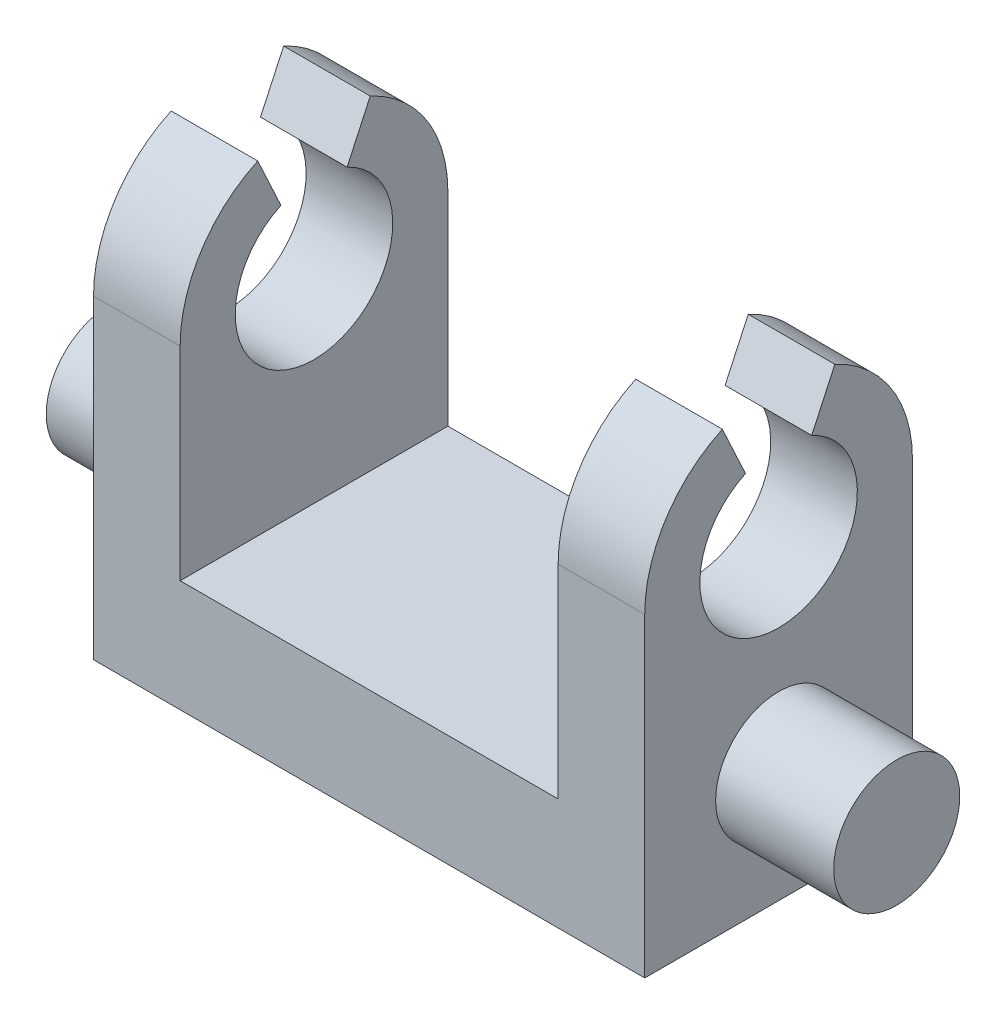
ISO-10303-21;
HEADER;
FILE_DESCRIPTION(('STEP AP214'),'2;1');
FILE_NAME('part.step','',(''),(''),'','','');
FILE_SCHEMA(('AUTOMOTIVE_DESIGN { 1 0 10303 214 1 1 1 1 }'));
ENDSEC;
DATA;
#1=APPLICATION_CONTEXT('core data for automotive mechanical design processes');
#2=APPLICATION_PROTOCOL_DEFINITION('international standard','automotive_design',2000,#1);
#3=PRODUCT_CONTEXT('',#1,'mechanical');
#4=PRODUCT('Part','Part','',(#3));
#5=PRODUCT_RELATED_PRODUCT_CATEGORY('part','',(#4));
#6=PRODUCT_DEFINITION_FORMATION('','',#4);
#7=PRODUCT_DEFINITION_CONTEXT('part definition',#1,'design');
#8=PRODUCT_DEFINITION('design','',#6,#7);
#9=PRODUCT_DEFINITION_SHAPE('','',#8);
#10=(LENGTH_UNIT() NAMED_UNIT(*) SI_UNIT(.MILLI.,.METRE.));
#11=(NAMED_UNIT(*) PLANE_ANGLE_UNIT() SI_UNIT($,.RADIAN.));
#12=(NAMED_UNIT(*) SI_UNIT($,.STERADIAN.) SOLID_ANGLE_UNIT());
#13=UNCERTAINTY_MEASURE_WITH_UNIT(LENGTH_MEASURE(1.E-05),#10,'distance_accuracy_value','');
#14=(GEOMETRIC_REPRESENTATION_CONTEXT(3) GLOBAL_UNCERTAINTY_ASSIGNED_CONTEXT((#13)) GLOBAL_UNIT_ASSIGNED_CONTEXT((#10,
#11,#12)) REPRESENTATION_CONTEXT('',''));
#15=CARTESIAN_POINT('',(0.,0.,0.));
#16=DIRECTION('',(0.,0.,1.));
#17=DIRECTION('',(1.,0.,0.));
#18=AXIS2_PLACEMENT_3D('',#15,#16,#17);
#19=CARTESIAN_POINT('',(35.,25.,0.));
#20=DIRECTION('',(-1.,0.,0.));
#21=DIRECTION('',(0.,0.,1.));
#22=AXIS2_PLACEMENT_3D('',#19,#20,#21);
#23=CYLINDRICAL_SURFACE('',#22,17.);
#24=CARTESIAN_POINT('',(-24.,25.,0.));
#25=DIRECTION('',(-1.,0.,0.));
#26=DIRECTION('',(0.,0.,1.));
#27=AXIS2_PLACEMENT_3D('',#24,#25,#26);
#28=CIRCLE('',#27,17.);
#29=CARTESIAN_POINT('',(-24.,25.,17.));
#30=VERTEX_POINT('',#29);
#31=CARTESIAN_POINT('',(-24.,40.4258547185672,7.14443883042323));
#32=VERTEX_POINT('',#31);
#33=EDGE_CURVE('E256',#30,#32,#28,.T.);
#34=ORIENTED_EDGE('',*,*,#33,.T.);
#35=DIRECTION('',(-1.,0.,0.));
#36=VECTOR('',#35,1.);
#37=CARTESIAN_POINT('',(51.3399201519814,40.4258547185672,7.14443883042323));
#38=LINE('',#37,#36);
#39=CARTESIAN_POINT('',(-35.,40.4258547185672,7.14443883042323));
#40=VERTEX_POINT('',#39);
#41=EDGE_CURVE('E62',#32,#40,#38,.T.);
#42=ORIENTED_EDGE('',*,*,#41,.T.);
#43=CARTESIAN_POINT('',(-35.,25.,0.));
#44=DIRECTION('',(1.,0.,0.));
#45=DIRECTION('',(0.,0.,1.));
#46=AXIS2_PLACEMENT_3D('',#43,#44,#45);
#47=CIRCLE('',#46,17.);
#48=CARTESIAN_POINT('',(-35.,25.,17.));
#49=VERTEX_POINT('',#48);
#50=EDGE_CURVE('E185',#40,#49,#47,.T.);
#51=ORIENTED_EDGE('',*,*,#50,.T.);
#52=DIRECTION('',(-1.,0.,0.));
#53=VECTOR('',#52,1.);
#54=CARTESIAN_POINT('',(35.,25.,17.));
#55=LINE('',#54,#53);
#56=EDGE_CURVE('E207',#30,#49,#55,.T.);
#57=ORIENTED_EDGE('',*,*,#56,.F.);
#58=EDGE_LOOP('',(#34,#42,#51,#57));
#59=FACE_BOUND('',#58,.T.);
#60=ADVANCED_FACE('F47',(#59),#23,.T.);
#61=CARTESIAN_POINT('',(35.,25.,0.));
#62=DIRECTION('',(1.,0.,0.));
#63=DIRECTION('',(0.,0.,1.));
#64=AXIS2_PLACEMENT_3D('',#61,#62,#63);
#65=CIRCLE('',#64,17.);
#66=CARTESIAN_POINT('',(35.,40.4258547185672,7.14443883042323));
#67=VERTEX_POINT('',#66);
#68=CARTESIAN_POINT('',(35.,25.,17.));
#69=VERTEX_POINT('',#68);
#70=EDGE_CURVE('E197',#67,#69,#65,.T.);
#71=ORIENTED_EDGE('',*,*,#70,.F.);
#72=CARTESIAN_POINT('',(24.,40.4258547185672,7.14443883042323));
#73=VERTEX_POINT('',#72);
#74=EDGE_CURVE('E307',#67,#73,#38,.T.);
#75=ORIENTED_EDGE('',*,*,#74,.T.);
#76=CARTESIAN_POINT('',(24.,25.,0.));
#77=DIRECTION('',(1.,0.,0.));
#78=DIRECTION('',(0.,1.,0.));
#79=AXIS2_PLACEMENT_3D('',#76,#77,#78);
#80=CIRCLE('',#79,17.);
#81=CARTESIAN_POINT('',(24.,25.,17.));
#82=VERTEX_POINT('',#81);
#83=EDGE_CURVE('E248',#73,#82,#80,.T.);
#84=ORIENTED_EDGE('',*,*,#83,.T.);
#85=EDGE_CURVE('E208',#69,#82,#55,.T.);
#86=ORIENTED_EDGE('',*,*,#85,.F.);
#87=EDGE_LOOP('',(#71,#75,#84,#86));
#88=FACE_BOUND('',#87,.T.);
#89=ADVANCED_FACE('F331',(#88),#23,.T.);
#90=CARTESIAN_POINT('',(-35.,25.,-17.));
#91=VERTEX_POINT('',#90);
#92=CARTESIAN_POINT('',(-35.,40.4258547185672,-7.14443883042322));
#93=VERTEX_POINT('',#92);
#94=EDGE_CURVE('E176',#91,#93,#47,.T.);
#95=ORIENTED_EDGE('',*,*,#94,.T.);
#96=DIRECTION('',(-1.,0.,0.));
#97=VECTOR('',#96,1.);
#98=CARTESIAN_POINT('',(51.3399201519814,40.4258547185672,-7.14443883042322));
#99=LINE('',#98,#97);
#100=CARTESIAN_POINT('',(-24.,40.4258547185672,-7.14443883042322));
#101=VERTEX_POINT('',#100);
#102=EDGE_CURVE('E158',#101,#93,#99,.T.);
#103=ORIENTED_EDGE('',*,*,#102,.F.);
#104=CARTESIAN_POINT('',(-24.,25.,-17.));
#105=VERTEX_POINT('',#104);
#106=EDGE_CURVE('E255',#101,#105,#28,.T.);
#107=ORIENTED_EDGE('',*,*,#106,.T.);
#108=DIRECTION('',(-1.,0.,0.));
#109=VECTOR('',#108,1.);
#110=CARTESIAN_POINT('',(35.,25.,-17.));
#111=LINE('',#110,#109);
#112=EDGE_CURVE('E182',#105,#91,#111,.T.);
#113=ORIENTED_EDGE('',*,*,#112,.T.);
#114=EDGE_LOOP('',(#95,#103,#107,#113));
#115=FACE_BOUND('',#114,.T.);
#116=ADVANCED_FACE('F180',(#115),#23,.T.);
#117=CARTESIAN_POINT('',(35.,25.,0.));
#118=DIRECTION('',(-1.,0.,0.));
#119=DIRECTION('',(0.,0.,1.));
#120=AXIS2_PLACEMENT_3D('',#117,#118,#119);
#121=CYLINDRICAL_SURFACE('',#120,10.);
#122=DIRECTION('',(-1.,0.,0.));
#123=VECTOR('',#122,1.);
#124=CARTESIAN_POINT('',(51.3399201519814,34.0740321873925,4.20261107671955));
#125=LINE('',#124,#123);
#126=CARTESIAN_POINT('',(-24.,34.0740321873925,4.20261107671955));
#127=VERTEX_POINT('',#126);
#128=CARTESIAN_POINT('',(-35.,34.0740321873925,4.20261107671955));
#129=VERTEX_POINT('',#128);
#130=EDGE_CURVE('E304',#127,#129,#125,.T.);
#131=ORIENTED_EDGE('',*,*,#130,.F.);
#132=CARTESIAN_POINT('',(-24.,25.,0.));
#133=DIRECTION('',(-1.,0.,0.));
#134=DIRECTION('',(0.,0.,1.));
#135=AXIS2_PLACEMENT_3D('',#132,#133,#134);
#136=CIRCLE('',#135,10.);
#137=CARTESIAN_POINT('',(-24.,34.0740321873925,-4.20261107671954));
#138=VERTEX_POINT('',#137);
#139=EDGE_CURVE('E228',#138,#127,#136,.T.);
#140=ORIENTED_EDGE('',*,*,#139,.F.);
#141=DIRECTION('',(-1.,0.,0.));
#142=VECTOR('',#141,1.);
#143=CARTESIAN_POINT('',(51.3399201519814,34.0740321873925,-4.20261107671954));
#144=LINE('',#143,#142);
#145=CARTESIAN_POINT('',(-35.,34.0740321873925,-4.20261107671954));
#146=VERTEX_POINT('',#145);
#147=EDGE_CURVE('E70',#138,#146,#144,.T.);
#148=ORIENTED_EDGE('',*,*,#147,.T.);
#149=CARTESIAN_POINT('',(-35.,25.,0.));
#150=DIRECTION('',(1.,0.,0.));
#151=DIRECTION('',(0.,0.,-1.));
#152=AXIS2_PLACEMENT_3D('',#149,#150,#151);
#153=CIRCLE('',#152,10.);
#154=EDGE_CURVE('E178',#129,#146,#153,.T.);
#155=ORIENTED_EDGE('',*,*,#154,.F.);
#156=EDGE_LOOP('',(#131,#140,#148,#155));
#157=FACE_BOUND('',#156,.T.);
#158=ADVANCED_FACE('F352',(#157),#121,.F.);
#159=CARTESIAN_POINT('',(50.,0.,0.));
#160=DIRECTION('',(-1.,0.,0.));
#161=DIRECTION('',(0.,0.,1.));
#162=AXIS2_PLACEMENT_3D('',#159,#160,#161);
#163=CYLINDRICAL_SURFACE('',#162,8.);
#164=CARTESIAN_POINT('',(50.,0.,0.));
#165=DIRECTION('',(1.,0.,0.));
#166=DIRECTION('',(0.,0.,-1.));
#167=AXIS2_PLACEMENT_3D('',#164,#165,#166);
#168=CIRCLE('',#167,8.);
#169=CARTESIAN_POINT('',(50.,0.,-8.));
#170=VERTEX_POINT('',#169);
#171=EDGE_CURVE('E212',#170,#170,#168,.T.);
#172=ORIENTED_EDGE('',*,*,#171,.F.);
#173=EDGE_LOOP('',(#172));
#174=FACE_BOUND('',#173,.T.);
#175=CARTESIAN_POINT('',(35.,0.,0.));
#176=DIRECTION('',(-1.,0.,0.));
#177=DIRECTION('',(0.,0.,1.));
#178=AXIS2_PLACEMENT_3D('',#175,#176,#177);
#179=CIRCLE('',#178,8.);
#180=CARTESIAN_POINT('',(35.,0.,8.));
#181=VERTEX_POINT('',#180);
#182=EDGE_CURVE('E215',#181,#181,#179,.T.);
#183=ORIENTED_EDGE('',*,*,#182,.F.);
#184=EDGE_LOOP('',(#183));
#185=FACE_BOUND('',#184,.T.);
#186=ADVANCED_FACE('F356',(#174,#185),#163,.T.);
#187=CARTESIAN_POINT('',(50.,0.,0.));
#188=DIRECTION('',(1.,0.,0.));
#189=DIRECTION('',(0.,0.,-1.));
#190=AXIS2_PLACEMENT_3D('',#187,#188,#189);
#191=PLANE('',#190);
#192=ORIENTED_EDGE('',*,*,#171,.T.);
#193=EDGE_LOOP('',(#192));
#194=FACE_BOUND('',#193,.T.);
#195=ADVANCED_FACE('F363',(#194),#191,.T.);
#196=CARTESIAN_POINT('',(35.,25.,0.));
#197=DIRECTION('',(-1.,0.,0.));
#198=DIRECTION('',(0.,0.,1.));
#199=AXIS2_PLACEMENT_3D('',#196,#197,#198);
#200=PLANE('',#199);
#201=ORIENTED_EDGE('',*,*,#182,.T.);
#202=EDGE_LOOP('',(#201));
#203=FACE_BOUND('',#202,.T.);
#204=CARTESIAN_POINT('',(35.,25.,0.));
#205=DIRECTION('',(1.,0.,0.));
#206=DIRECTION('',(0.,0.,-1.));
#207=AXIS2_PLACEMENT_3D('',#204,#205,#206);
#208=CIRCLE('',#207,10.);
#209=CARTESIAN_POINT('',(35.,34.0740321873925,4.20261107671955));
#210=VERTEX_POINT('',#209);
#211=CARTESIAN_POINT('',(35.,34.0740321873925,-4.20261107671954));
#212=VERTEX_POINT('',#211);
#213=EDGE_CURVE('E189',#210,#212,#208,.T.);
#214=ORIENTED_EDGE('',*,*,#213,.F.);
#215=DIRECTION('',(0.,-0.907403218739245,-0.420261107671954));
#216=VECTOR('',#215,1.);
#217=CARTESIAN_POINT('',(35.,40.4258547185672,7.14443883042323));
#218=LINE('',#217,#216);
#219=EDGE_CURVE('E300',#67,#210,#218,.T.);
#220=ORIENTED_EDGE('',*,*,#219,.F.);
#221=ORIENTED_EDGE('',*,*,#70,.T.);
#222=DIRECTION('',(0.,-1.,0.));
#223=VECTOR('',#222,1.);
#224=CARTESIAN_POINT('',(35.,25.,17.));
#225=LINE('',#224,#223);
#226=CARTESIAN_POINT('',(35.,-15.,17.));
#227=VERTEX_POINT('',#226);
#228=EDGE_CURVE('E267',#69,#227,#225,.T.);
#229=ORIENTED_EDGE('',*,*,#228,.T.);
#230=DIRECTION('',(0.,0.,-1.));
#231=VECTOR('',#230,1.);
#232=CARTESIAN_POINT('',(35.,-15.,17.));
#233=LINE('',#232,#231);
#234=CARTESIAN_POINT('',(35.,-15.,-17.));
#235=VERTEX_POINT('',#234);
#236=EDGE_CURVE('E268',#227,#235,#233,.T.);
#237=ORIENTED_EDGE('',*,*,#236,.T.);
#238=DIRECTION('',(0.,1.,0.));
#239=VECTOR('',#238,1.);
#240=CARTESIAN_POINT('',(35.,25.,-17.));
#241=LINE('',#240,#239);
#242=CARTESIAN_POINT('',(35.,25.,-17.));
#243=VERTEX_POINT('',#242);
#244=EDGE_CURVE('E191',#235,#243,#241,.T.);
#245=ORIENTED_EDGE('',*,*,#244,.T.);
#246=CARTESIAN_POINT('',(35.,40.4258547185672,-7.14443883042322));
#247=VERTEX_POINT('',#246);
#248=EDGE_CURVE('E265',#243,#247,#65,.T.);
#249=ORIENTED_EDGE('',*,*,#248,.T.);
#250=DIRECTION('',(0.,0.907403218739245,-0.420261107671955));
#251=VECTOR('',#250,1.);
#252=CARTESIAN_POINT('',(35.,40.4258547185672,-7.14443883042322));
#253=LINE('',#252,#251);
#254=EDGE_CURVE('E299',#212,#247,#253,.T.);
#255=ORIENTED_EDGE('',*,*,#254,.F.);
#256=EDGE_LOOP('',(#214,#220,#221,#229,#237,#245,#249,#255));
#257=FACE_BOUND('',#256,.T.);
#258=ADVANCED_FACE('F274',(#203,#257),#200,.F.);
#259=CARTESIAN_POINT('',(-35.,25.,0.));
#260=DIRECTION('',(-1.,0.,0.));
#261=DIRECTION('',(0.,0.,1.));
#262=AXIS2_PLACEMENT_3D('',#259,#260,#261);
#263=PLANE('',#262);
#264=DIRECTION('',(0.,0.907403218739245,0.420261107671954));
#265=VECTOR('',#264,1.);
#266=CARTESIAN_POINT('',(-35.,40.4258547185672,7.14443883042323));
#267=LINE('',#266,#265);
#268=EDGE_CURVE('E167',#129,#40,#267,.T.);
#269=ORIENTED_EDGE('',*,*,#268,.F.);
#270=ORIENTED_EDGE('',*,*,#154,.T.);
#271=DIRECTION('',(0.,-0.907403218739245,0.420261107671955));
#272=VECTOR('',#271,1.);
#273=CARTESIAN_POINT('',(-35.,40.4258547185672,-7.14443883042322));
#274=LINE('',#273,#272);
#275=EDGE_CURVE('E161',#93,#146,#274,.T.);
#276=ORIENTED_EDGE('',*,*,#275,.F.);
#277=ORIENTED_EDGE('',*,*,#94,.F.);
#278=DIRECTION('',(0.,1.,0.));
#279=VECTOR('',#278,1.);
#280=CARTESIAN_POINT('',(-35.,25.,-17.));
#281=LINE('',#280,#279);
#282=CARTESIAN_POINT('',(-35.,-15.,-17.));
#283=VERTEX_POINT('',#282);
#284=EDGE_CURVE('E195',#283,#91,#281,.T.);
#285=ORIENTED_EDGE('',*,*,#284,.F.);
#286=DIRECTION('',(0.,0.,-1.));
#287=VECTOR('',#286,1.);
#288=CARTESIAN_POINT('',(-35.,-15.,17.));
#289=LINE('',#288,#287);
#290=CARTESIAN_POINT('',(-35.,-15.,17.));
#291=VERTEX_POINT('',#290);
#292=EDGE_CURVE('E187',#291,#283,#289,.T.);
#293=ORIENTED_EDGE('',*,*,#292,.F.);
#294=DIRECTION('',(0.,-1.,0.));
#295=VECTOR('',#294,1.);
#296=CARTESIAN_POINT('',(-35.,25.,17.));
#297=LINE('',#296,#295);
#298=EDGE_CURVE('E184',#49,#291,#297,.T.);
#299=ORIENTED_EDGE('',*,*,#298,.F.);
#300=ORIENTED_EDGE('',*,*,#50,.F.);
#301=EDGE_LOOP('',(#269,#270,#276,#277,#285,#293,#299,#300));
#302=FACE_BOUND('',#301,.T.);
#303=CARTESIAN_POINT('',(-35.,0.,0.));
#304=DIRECTION('',(-1.,0.,0.));
#305=DIRECTION('',(0.,0.,1.));
#306=AXIS2_PLACEMENT_3D('',#303,#304,#305);
#307=CIRCLE('',#306,8.);
#308=CARTESIAN_POINT('',(-35.,0.,8.));
#309=VERTEX_POINT('',#308);
#310=EDGE_CURVE('E211',#309,#309,#307,.T.);
#311=ORIENTED_EDGE('',*,*,#310,.F.);
#312=EDGE_LOOP('',(#311));
#313=FACE_BOUND('',#312,.T.);
#314=ADVANCED_FACE('F173',(#302,#313),#263,.T.);
#315=CARTESIAN_POINT('',(24.,25.,-17.));
#316=VERTEX_POINT('',#315);
#317=CARTESIAN_POINT('',(24.,40.4258547185672,-7.14443883042322));
#318=VERTEX_POINT('',#317);
#319=EDGE_CURVE('E237',#316,#318,#80,.T.);
#320=ORIENTED_EDGE('',*,*,#319,.T.);
#321=EDGE_CURVE('E166',#247,#318,#99,.T.);
#322=ORIENTED_EDGE('',*,*,#321,.F.);
#323=ORIENTED_EDGE('',*,*,#248,.F.);
#324=EDGE_CURVE('E198',#243,#316,#111,.T.);
#325=ORIENTED_EDGE('',*,*,#324,.T.);
#326=EDGE_LOOP('',(#320,#322,#323,#325));
#327=FACE_BOUND('',#326,.T.);
#328=ADVANCED_FACE('F244',(#327),#23,.T.);
#329=CARTESIAN_POINT('',(35.,25.,17.));
#330=DIRECTION('',(0.,0.,-1.));
#331=DIRECTION('',(0.,1.,0.));
#332=AXIS2_PLACEMENT_3D('',#329,#330,#331);
#333=PLANE('',#332);
#334=DIRECTION('',(0.,-1.,0.));
#335=VECTOR('',#334,1.);
#336=CARTESIAN_POINT('',(24.,25.,17.));
#337=LINE('',#336,#335);
#338=CARTESIAN_POINT('',(24.,-0.810000000000006,17.));
#339=VERTEX_POINT('',#338);
#340=EDGE_CURVE('E231',#82,#339,#337,.T.);
#341=ORIENTED_EDGE('',*,*,#340,.T.);
#342=DIRECTION('',(-1.,0.,0.));
#343=VECTOR('',#342,1.);
#344=CARTESIAN_POINT('',(24.,-0.810000000000006,17.));
#345=LINE('',#344,#343);
#346=CARTESIAN_POINT('',(-24.,-0.810000000000006,17.));
#347=VERTEX_POINT('',#346);
#348=EDGE_CURVE('E290',#339,#347,#345,.T.);
#349=ORIENTED_EDGE('',*,*,#348,.T.);
#350=DIRECTION('',(0.,1.,0.));
#351=VECTOR('',#350,1.);
#352=CARTESIAN_POINT('',(-24.,25.,17.));
#353=LINE('',#352,#351);
#354=EDGE_CURVE('E259',#347,#30,#353,.T.);
#355=ORIENTED_EDGE('',*,*,#354,.T.);
#356=ORIENTED_EDGE('',*,*,#56,.T.);
#357=ORIENTED_EDGE('',*,*,#298,.T.);
#358=DIRECTION('',(-1.,0.,0.));
#359=VECTOR('',#358,1.);
#360=CARTESIAN_POINT('',(35.,-15.,17.));
#361=LINE('',#360,#359);
#362=EDGE_CURVE('E204',#227,#291,#361,.T.);
#363=ORIENTED_EDGE('',*,*,#362,.F.);
#364=ORIENTED_EDGE('',*,*,#228,.F.);
#365=ORIENTED_EDGE('',*,*,#85,.T.);
#366=EDGE_LOOP('',(#341,#349,#355,#356,#357,#363,#364,#365));
#367=FACE_BOUND('',#366,.T.);
#368=ADVANCED_FACE('F342',(#367),#333,.F.);
#369=CARTESIAN_POINT('',(35.,-15.,17.));
#370=DIRECTION('',(0.,1.,0.));
#371=DIRECTION('',(0.,0.,1.));
#372=AXIS2_PLACEMENT_3D('',#369,#370,#371);
#373=PLANE('',#372);
#374=ORIENTED_EDGE('',*,*,#292,.T.);
#375=DIRECTION('',(-1.,0.,0.));
#376=VECTOR('',#375,1.);
#377=CARTESIAN_POINT('',(35.,-15.,-17.));
#378=LINE('',#377,#376);
#379=EDGE_CURVE('E201',#235,#283,#378,.T.);
#380=ORIENTED_EDGE('',*,*,#379,.F.);
#381=ORIENTED_EDGE('',*,*,#236,.F.);
#382=ORIENTED_EDGE('',*,*,#362,.T.);
#383=EDGE_LOOP('',(#374,#380,#381,#382));
#384=FACE_BOUND('',#383,.T.);
#385=ADVANCED_FACE('F348',(#384),#373,.F.);
#386=CARTESIAN_POINT('',(35.,25.,-17.));
#387=DIRECTION('',(0.,0.,1.));
#388=DIRECTION('',(0.,-1.,0.));
#389=AXIS2_PLACEMENT_3D('',#386,#387,#388);
#390=PLANE('',#389);
#391=DIRECTION('',(-1.,0.,0.));
#392=VECTOR('',#391,1.);
#393=CARTESIAN_POINT('',(24.,-0.809999999999994,-17.));
#394=LINE('',#393,#392);
#395=CARTESIAN_POINT('',(24.,-0.809999999999994,-17.));
#396=VERTEX_POINT('',#395);
#397=CARTESIAN_POINT('',(-24.,-0.809999999999994,-17.));
#398=VERTEX_POINT('',#397);
#399=EDGE_CURVE('E280',#396,#398,#394,.T.);
#400=ORIENTED_EDGE('',*,*,#399,.F.);
#401=DIRECTION('',(0.,1.,0.));
#402=VECTOR('',#401,1.);
#403=CARTESIAN_POINT('',(24.,25.,-17.));
#404=LINE('',#403,#402);
#405=EDGE_CURVE('E226',#396,#316,#404,.T.);
#406=ORIENTED_EDGE('',*,*,#405,.T.);
#407=ORIENTED_EDGE('',*,*,#324,.F.);
#408=ORIENTED_EDGE('',*,*,#244,.F.);
#409=ORIENTED_EDGE('',*,*,#379,.T.);
#410=ORIENTED_EDGE('',*,*,#284,.T.);
#411=ORIENTED_EDGE('',*,*,#112,.F.);
#412=DIRECTION('',(0.,-1.,0.));
#413=VECTOR('',#412,1.);
#414=CARTESIAN_POINT('',(-24.,25.,-17.));
#415=LINE('',#414,#413);
#416=EDGE_CURVE('E230',#105,#398,#415,.T.);
#417=ORIENTED_EDGE('',*,*,#416,.T.);
#418=EDGE_LOOP('',(#400,#406,#407,#408,#409,#410,#411,#417));
#419=FACE_BOUND('',#418,.T.);
#420=ADVANCED_FACE('F278',(#419),#390,.F.);
#421=CARTESIAN_POINT('',(24.,34.0740321873925,4.20261107671955));
#422=VERTEX_POINT('',#421);
#423=EDGE_CURVE('E305',#210,#422,#125,.T.);
#424=ORIENTED_EDGE('',*,*,#423,.F.);
#425=ORIENTED_EDGE('',*,*,#213,.T.);
#426=CARTESIAN_POINT('',(24.,34.0740321873925,-4.20261107671954));
#427=VERTEX_POINT('',#426);
#428=EDGE_CURVE('E302',#212,#427,#144,.T.);
#429=ORIENTED_EDGE('',*,*,#428,.T.);
#430=CARTESIAN_POINT('',(24.,25.,0.));
#431=DIRECTION('',(1.,0.,0.));
#432=DIRECTION('',(0.,1.,0.));
#433=AXIS2_PLACEMENT_3D('',#430,#431,#432);
#434=CIRCLE('',#433,10.);
#435=EDGE_CURVE('E223',#422,#427,#434,.T.);
#436=ORIENTED_EDGE('',*,*,#435,.F.);
#437=EDGE_LOOP('',(#424,#425,#429,#436));
#438=FACE_BOUND('',#437,.T.);
#439=ADVANCED_FACE('F317',(#438),#121,.F.);
#440=CARTESIAN_POINT('',(-50.,0.,0.));
#441=DIRECTION('',(1.,0.,0.));
#442=DIRECTION('',(0.,0.,-1.));
#443=AXIS2_PLACEMENT_3D('',#440,#441,#442);
#444=PLANE('',#443);
#445=CARTESIAN_POINT('',(-50.,0.,0.));
#446=DIRECTION('',(1.,0.,0.));
#447=DIRECTION('',(0.,0.,-1.));
#448=AXIS2_PLACEMENT_3D('',#445,#446,#447);
#449=CIRCLE('',#448,8.);
#450=CARTESIAN_POINT('',(-50.,0.,-8.));
#451=VERTEX_POINT('',#450);
#452=EDGE_CURVE('E216',#451,#451,#449,.T.);
#453=ORIENTED_EDGE('',*,*,#452,.F.);
#454=EDGE_LOOP('',(#453));
#455=FACE_BOUND('',#454,.T.);
#456=ADVANCED_FACE('F368',(#455),#444,.F.);
#457=ORIENTED_EDGE('',*,*,#310,.T.);
#458=EDGE_LOOP('',(#457));
#459=FACE_BOUND('',#458,.T.);
#460=ORIENTED_EDGE('',*,*,#452,.T.);
#461=EDGE_LOOP('',(#460));
#462=FACE_BOUND('',#461,.T.);
#463=ADVANCED_FACE('F49',(#459,#462),#163,.T.);
#464=CARTESIAN_POINT('',(-24.,0.,-35.));
#465=DIRECTION('',(-1.,0.,0.));
#466=DIRECTION('',(0.,0.,1.));
#467=AXIS2_PLACEMENT_3D('',#464,#465,#466);
#468=PLANE('',#467);
#469=ORIENTED_EDGE('',*,*,#139,.T.);
#470=DIRECTION('',(0.,0.907403218739245,0.420261107671954));
#471=VECTOR('',#470,1.);
#472=CARTESIAN_POINT('',(-24.,-8.93163489789437,-15.7153359970693));
#473=LINE('',#472,#471);
#474=EDGE_CURVE('E295',#127,#32,#473,.T.);
#475=ORIENTED_EDGE('',*,*,#474,.T.);
#476=ORIENTED_EDGE('',*,*,#33,.F.);
#477=ORIENTED_EDGE('',*,*,#354,.F.);
#478=DIRECTION('',(0.,0.,-1.));
#479=VECTOR('',#478,1.);
#480=CARTESIAN_POINT('',(-24.,-0.810000000000006,17.));
#481=LINE('',#480,#479);
#482=EDGE_CURVE('E227',#347,#398,#481,.T.);
#483=ORIENTED_EDGE('',*,*,#482,.T.);
#484=ORIENTED_EDGE('',*,*,#416,.F.);
#485=ORIENTED_EDGE('',*,*,#106,.F.);
#486=DIRECTION('',(0.,-0.907403218739245,0.420261107671955));
#487=VECTOR('',#486,1.);
#488=CARTESIAN_POINT('',(-24.,17.7626048289773,3.35197809355327));
#489=LINE('',#488,#487);
#490=EDGE_CURVE('E162',#101,#138,#489,.T.);
#491=ORIENTED_EDGE('',*,*,#490,.T.);
#492=EDGE_LOOP('',(#469,#475,#476,#477,#483,#484,#485,#491));
#493=FACE_BOUND('',#492,.T.);
#494=ADVANCED_FACE('F443',(#493),#468,.F.);
#495=CARTESIAN_POINT('',(24.,0.,-35.));
#496=DIRECTION('',(1.,0.,0.));
#497=DIRECTION('',(0.,1.,0.));
#498=AXIS2_PLACEMENT_3D('',#495,#496,#497);
#499=PLANE('',#498);
#500=ORIENTED_EDGE('',*,*,#83,.F.);
#501=DIRECTION('',(0.,-0.907403218739245,-0.420261107671954));
#502=VECTOR('',#501,1.);
#503=CARTESIAN_POINT('',(24.,-8.93163489789436,-15.7153359970693));
#504=LINE('',#503,#502);
#505=EDGE_CURVE('E11',#73,#422,#504,.T.);
#506=ORIENTED_EDGE('',*,*,#505,.T.);
#507=ORIENTED_EDGE('',*,*,#435,.T.);
#508=DIRECTION('',(0.,0.907403218739245,-0.420261107671955));
#509=VECTOR('',#508,1.);
#510=CARTESIAN_POINT('',(24.,17.7626048289773,3.35197809355327));
#511=LINE('',#510,#509);
#512=EDGE_CURVE('E55',#427,#318,#511,.T.);
#513=ORIENTED_EDGE('',*,*,#512,.T.);
#514=ORIENTED_EDGE('',*,*,#319,.F.);
#515=ORIENTED_EDGE('',*,*,#405,.F.);
#516=DIRECTION('',(0.,0.,-1.));
#517=VECTOR('',#516,1.);
#518=CARTESIAN_POINT('',(24.,-0.810000000000006,17.));
#519=LINE('',#518,#517);
#520=EDGE_CURVE('E284',#339,#396,#519,.T.);
#521=ORIENTED_EDGE('',*,*,#520,.F.);
#522=ORIENTED_EDGE('',*,*,#340,.F.);
#523=EDGE_LOOP('',(#500,#506,#507,#513,#514,#515,#521,#522));
#524=FACE_BOUND('',#523,.T.);
#525=ADVANCED_FACE('F236',(#524),#499,.F.);
#526=CARTESIAN_POINT('',(24.,-0.810000000000006,17.));
#527=DIRECTION('',(0.,-1.,0.));
#528=DIRECTION('',(0.,0.,-1.));
#529=AXIS2_PLACEMENT_3D('',#526,#527,#528);
#530=PLANE('',#529);
#531=ORIENTED_EDGE('',*,*,#399,.T.);
#532=ORIENTED_EDGE('',*,*,#482,.F.);
#533=ORIENTED_EDGE('',*,*,#348,.F.);
#534=ORIENTED_EDGE('',*,*,#520,.T.);
#535=EDGE_LOOP('',(#531,#532,#533,#534));
#536=FACE_BOUND('',#535,.T.);
#537=ADVANCED_FACE('F287',(#536),#530,.F.);
#538=CARTESIAN_POINT('',(51.3399201519814,40.4258547185672,-7.14443883042322));
#539=DIRECTION('',(0.,-0.420261107671955,-0.907403218739245));
#540=DIRECTION('',(0.,0.907403218739245,-0.420261107671955));
#541=AXIS2_PLACEMENT_3D('',#538,#539,#540);
#542=PLANE('',#541);
#543=ORIENTED_EDGE('',*,*,#428,.F.);
#544=ORIENTED_EDGE('',*,*,#254,.T.);
#545=ORIENTED_EDGE('',*,*,#321,.T.);
#546=ORIENTED_EDGE('',*,*,#512,.F.);
#547=EDGE_LOOP('',(#543,#544,#545,#546));
#548=FACE_BOUND('',#547,.T.);
#549=ADVANCED_FACE('F318',(#548),#542,.F.);
#550=CARTESIAN_POINT('',(51.3399201519814,40.4258547185672,7.14443883042323));
#551=DIRECTION('',(0.,-0.420261107671954,0.907403218739245));
#552=DIRECTION('',(0.,-0.907403218739245,-0.420261107671954));
#553=AXIS2_PLACEMENT_3D('',#550,#551,#552);
#554=PLANE('',#553);
#555=ORIENTED_EDGE('',*,*,#74,.F.);
#556=ORIENTED_EDGE('',*,*,#219,.T.);
#557=ORIENTED_EDGE('',*,*,#423,.T.);
#558=ORIENTED_EDGE('',*,*,#505,.F.);
#559=EDGE_LOOP('',(#555,#556,#557,#558));
#560=FACE_BOUND('',#559,.T.);
#561=ADVANCED_FACE('F314',(#560),#554,.F.);
#562=ORIENTED_EDGE('',*,*,#102,.T.);
#563=ORIENTED_EDGE('',*,*,#275,.T.);
#564=ORIENTED_EDGE('',*,*,#147,.F.);
#565=ORIENTED_EDGE('',*,*,#490,.F.);
#566=EDGE_LOOP('',(#562,#563,#564,#565));
#567=FACE_BOUND('',#566,.T.);
#568=ADVANCED_FACE('F160',(#567),#542,.F.);
#569=ORIENTED_EDGE('',*,*,#130,.T.);
#570=ORIENTED_EDGE('',*,*,#268,.T.);
#571=ORIENTED_EDGE('',*,*,#41,.F.);
#572=ORIENTED_EDGE('',*,*,#474,.F.);
#573=EDGE_LOOP('',(#569,#570,#571,#572));
#574=FACE_BOUND('',#573,.T.);
#575=ADVANCED_FACE('F326',(#574),#554,.F.);
#576=CLOSED_SHELL('',(#60,#89,#116,#158,#186,#195,#258,#314,#328,#368,#385,#420,#439,#456,#463,
#494,#525,#537,#549,#561,#568,#575));
#577=MANIFOLD_SOLID_BREP('B2',#576);
#578=ADVANCED_BREP_SHAPE_REPRESENTATION('',(#18,#577),#14);
#579=SHAPE_DEFINITION_REPRESENTATION(#9,#578);
ENDSEC;
END-ISO-10303-21;
